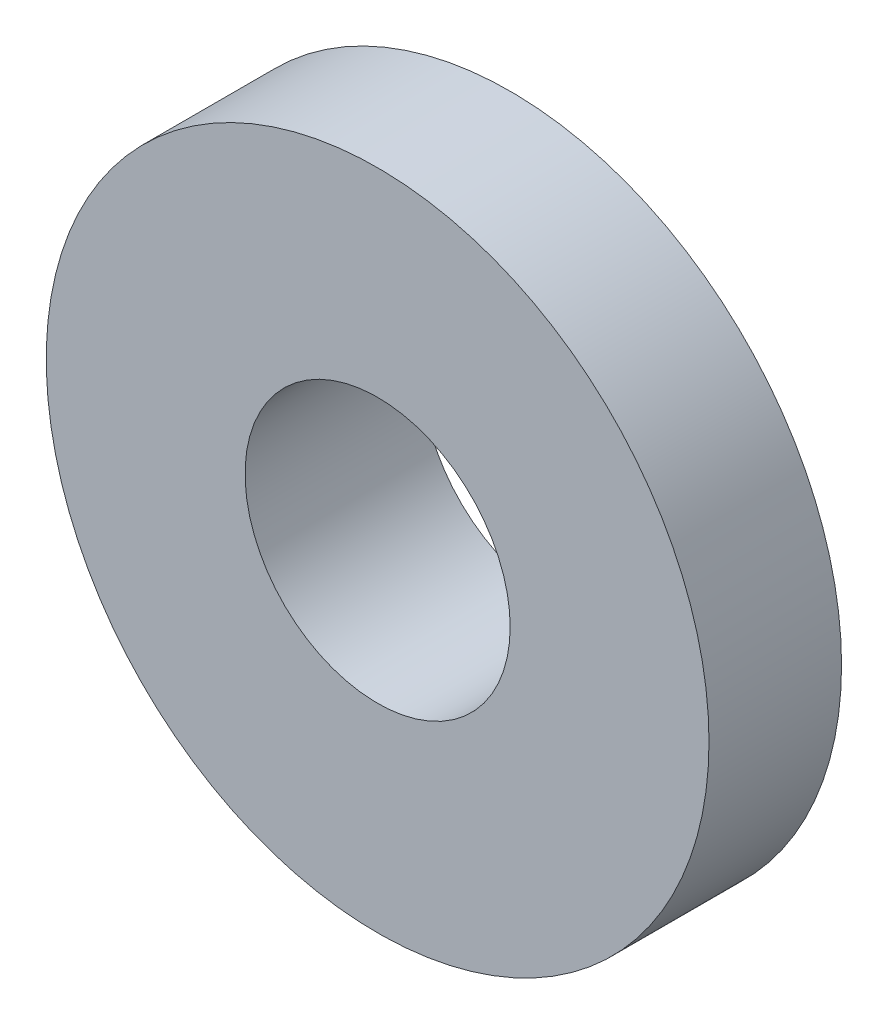
ISO-10303-21;
HEADER;
FILE_DESCRIPTION(('STEP AP214'),'2;1');
FILE_NAME('part.step','',(''),(''),'','','');
FILE_SCHEMA(('AUTOMOTIVE_DESIGN { 1 0 10303 214 1 1 1 1 }'));
ENDSEC;
DATA;
#1=APPLICATION_CONTEXT('core data for automotive mechanical design processes');
#2=APPLICATION_PROTOCOL_DEFINITION('international standard','automotive_design',2000,#1);
#3=PRODUCT_CONTEXT('',#1,'mechanical');
#4=PRODUCT('Part','Part','',(#3));
#5=PRODUCT_RELATED_PRODUCT_CATEGORY('part','',(#4));
#6=PRODUCT_DEFINITION_FORMATION('','',#4);
#7=PRODUCT_DEFINITION_CONTEXT('part definition',#1,'design');
#8=PRODUCT_DEFINITION('design','',#6,#7);
#9=PRODUCT_DEFINITION_SHAPE('','',#8);
#10=(LENGTH_UNIT() NAMED_UNIT(*) SI_UNIT(.MILLI.,.METRE.));
#11=(NAMED_UNIT(*) PLANE_ANGLE_UNIT() SI_UNIT($,.RADIAN.));
#12=(NAMED_UNIT(*) SI_UNIT($,.STERADIAN.) SOLID_ANGLE_UNIT());
#13=UNCERTAINTY_MEASURE_WITH_UNIT(LENGTH_MEASURE(1.E-05),#10,'distance_accuracy_value','');
#14=(GEOMETRIC_REPRESENTATION_CONTEXT(3) GLOBAL_UNCERTAINTY_ASSIGNED_CONTEXT((#13)) GLOBAL_UNIT_ASSIGNED_CONTEXT((#10,
#11,#12)) REPRESENTATION_CONTEXT('',''));
#15=CARTESIAN_POINT('',(0.,0.,0.));
#16=DIRECTION('',(0.,0.,1.));
#17=DIRECTION('',(1.,0.,0.));
#18=AXIS2_PLACEMENT_3D('',#15,#16,#17);
#19=CARTESIAN_POINT('',(0.,0.,1.5));
#20=DIRECTION('',(0.,0.,-1.));
#21=DIRECTION('',(-1.,0.,0.));
#22=AXIS2_PLACEMENT_3D('',#19,#20,#21);
#23=CYLINDRICAL_SURFACE('',#22,3.75);
#24=CARTESIAN_POINT('',(0.,0.,1.5));
#25=DIRECTION('',(0.,0.,1.));
#26=DIRECTION('',(1.,0.,0.));
#27=AXIS2_PLACEMENT_3D('',#24,#25,#26);
#28=CIRCLE('',#27,3.75);
#29=CARTESIAN_POINT('',(3.75,0.,1.5));
#30=VERTEX_POINT('',#29);
#31=EDGE_CURVE('E45',#30,#30,#28,.T.);
#32=ORIENTED_EDGE('',*,*,#31,.F.);
#33=EDGE_LOOP('',(#32));
#34=FACE_BOUND('',#33,.T.);
#35=CARTESIAN_POINT('',(0.,0.,0.));
#36=DIRECTION('',(0.,0.,1.));
#37=DIRECTION('',(1.,0.,0.));
#38=AXIS2_PLACEMENT_3D('',#35,#36,#37);
#39=CIRCLE('',#38,3.75);
#40=CARTESIAN_POINT('',(3.75,0.,0.));
#41=VERTEX_POINT('',#40);
#42=EDGE_CURVE('E40',#41,#41,#39,.T.);
#43=ORIENTED_EDGE('',*,*,#42,.T.);
#44=EDGE_LOOP('',(#43));
#45=FACE_BOUND('',#44,.T.);
#46=ADVANCED_FACE('F37',(#34,#45),#23,.T.);
#47=CARTESIAN_POINT('',(0.,0.,1.5));
#48=DIRECTION('',(0.,0.,-1.));
#49=DIRECTION('',(-1.,0.,0.));
#50=AXIS2_PLACEMENT_3D('',#47,#48,#49);
#51=CYLINDRICAL_SURFACE('',#50,1.5);
#52=CARTESIAN_POINT('',(0.,0.,1.5));
#53=DIRECTION('',(0.,0.,1.));
#54=DIRECTION('',(1.,0.,0.));
#55=AXIS2_PLACEMENT_3D('',#52,#53,#54);
#56=CIRCLE('',#55,1.5);
#57=CARTESIAN_POINT('',(1.5,0.,1.5));
#58=VERTEX_POINT('',#57);
#59=EDGE_CURVE('E10',#58,#58,#56,.T.);
#60=ORIENTED_EDGE('',*,*,#59,.T.);
#61=EDGE_LOOP('',(#60));
#62=FACE_BOUND('',#61,.T.);
#63=CARTESIAN_POINT('',(0.,0.,-0.5));
#64=DIRECTION('',(0.,0.,1.));
#65=DIRECTION('',(1.,0.,0.));
#66=AXIS2_PLACEMENT_3D('',#63,#64,#65);
#67=CIRCLE('',#66,1.5);
#68=CARTESIAN_POINT('',(1.5,0.,-0.5));
#69=VERTEX_POINT('',#68);
#70=EDGE_CURVE('E56',#69,#69,#67,.T.);
#71=ORIENTED_EDGE('',*,*,#70,.F.);
#72=EDGE_LOOP('',(#71));
#73=FACE_BOUND('',#72,.T.);
#74=ADVANCED_FACE('F68',(#62,#73),#51,.F.);
#75=CARTESIAN_POINT('',(0.,0.,1.5));
#76=DIRECTION('',(0.,0.,1.));
#77=DIRECTION('',(1.,0.,0.));
#78=AXIS2_PLACEMENT_3D('',#75,#76,#77);
#79=PLANE('',#78);
#80=ORIENTED_EDGE('',*,*,#31,.T.);
#81=EDGE_LOOP('',(#80));
#82=FACE_BOUND('',#81,.T.);
#83=ORIENTED_EDGE('',*,*,#59,.F.);
#84=EDGE_LOOP('',(#83));
#85=FACE_BOUND('',#84,.T.);
#86=ADVANCED_FACE('F70',(#82,#85),#79,.T.);
#87=CARTESIAN_POINT('',(0.,0.,0.));
#88=DIRECTION('',(0.,0.,1.));
#89=DIRECTION('',(1.,0.,0.));
#90=AXIS2_PLACEMENT_3D('',#87,#88,#89);
#91=PLANE('',#90);
#92=CARTESIAN_POINT('',(0.,0.,0.));
#93=DIRECTION('',(0.,0.,1.));
#94=DIRECTION('',(1.,0.,0.));
#95=AXIS2_PLACEMENT_3D('',#92,#93,#94);
#96=CIRCLE('',#95,2.5);
#97=CARTESIAN_POINT('',(2.5,0.,0.));
#98=VERTEX_POINT('',#97);
#99=EDGE_CURVE('E52',#98,#98,#96,.T.);
#100=ORIENTED_EDGE('',*,*,#99,.T.);
#101=EDGE_LOOP('',(#100));
#102=FACE_BOUND('',#101,.T.);
#103=ORIENTED_EDGE('',*,*,#42,.F.);
#104=EDGE_LOOP('',(#103));
#105=FACE_BOUND('',#104,.T.);
#106=ADVANCED_FACE('F76',(#102,#105),#91,.F.);
#107=CARTESIAN_POINT('',(0.,0.,-0.5));
#108=DIRECTION('',(0.,0.,1.));
#109=DIRECTION('',(1.,0.,0.));
#110=AXIS2_PLACEMENT_3D('',#107,#108,#109);
#111=CYLINDRICAL_SURFACE('',#110,2.5);
#112=CARTESIAN_POINT('',(0.,0.,-0.5));
#113=DIRECTION('',(0.,0.,1.));
#114=DIRECTION('',(1.,0.,0.));
#115=AXIS2_PLACEMENT_3D('',#112,#113,#114);
#116=CIRCLE('',#115,2.5);
#117=CARTESIAN_POINT('',(2.5,0.,-0.5));
#118=VERTEX_POINT('',#117);
#119=EDGE_CURVE('E57',#118,#118,#116,.T.);
#120=ORIENTED_EDGE('',*,*,#119,.T.);
#121=EDGE_LOOP('',(#120));
#122=FACE_BOUND('',#121,.T.);
#123=ORIENTED_EDGE('',*,*,#99,.F.);
#124=EDGE_LOOP('',(#123));
#125=FACE_BOUND('',#124,.T.);
#126=ADVANCED_FACE('F83',(#122,#125),#111,.T.);
#127=CARTESIAN_POINT('',(0.,0.,-0.5));
#128=DIRECTION('',(0.,0.,1.));
#129=DIRECTION('',(1.,0.,0.));
#130=AXIS2_PLACEMENT_3D('',#127,#128,#129);
#131=PLANE('',#130);
#132=ORIENTED_EDGE('',*,*,#70,.T.);
#133=EDGE_LOOP('',(#132));
#134=FACE_BOUND('',#133,.T.);
#135=ORIENTED_EDGE('',*,*,#119,.F.);
#136=EDGE_LOOP('',(#135));
#137=FACE_BOUND('',#136,.T.);
#138=ADVANCED_FACE('F65',(#134,#137),#131,.F.);
#139=CLOSED_SHELL('',(#46,#74,#86,#106,#126,#138));
#140=MANIFOLD_SOLID_BREP('B2',#139);
#141=ADVANCED_BREP_SHAPE_REPRESENTATION('',(#18,#140),#14);
#142=SHAPE_DEFINITION_REPRESENTATION(#9,#141);
ENDSEC;
END-ISO-10303-21;
